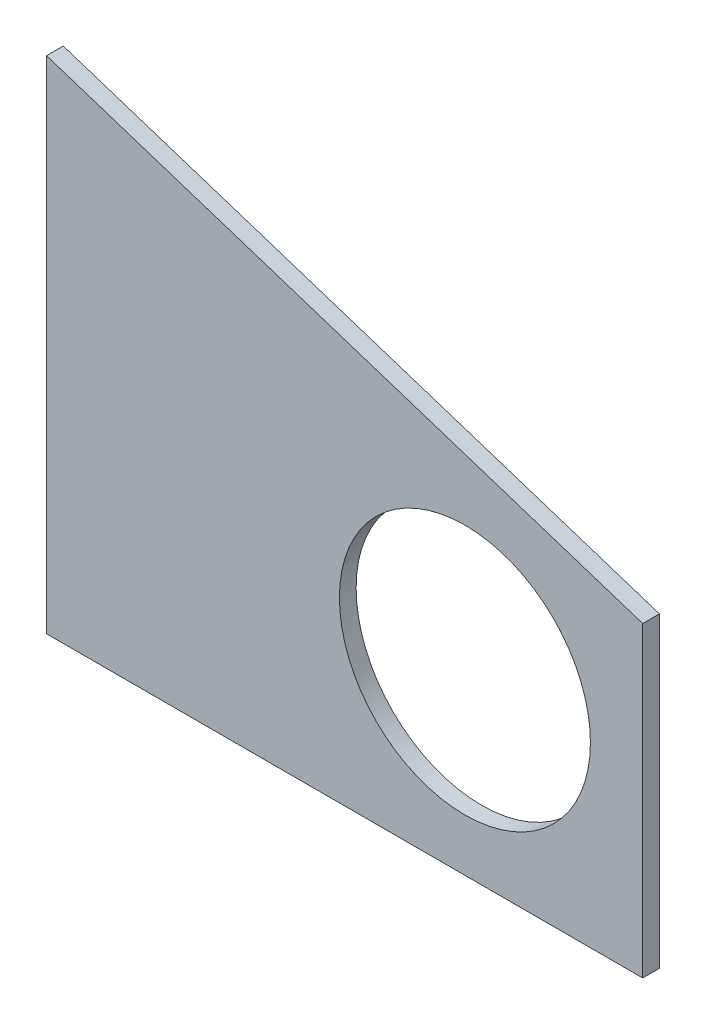
ISO-10303-21;
HEADER;
FILE_DESCRIPTION(('STEP AP214'),'2;1');
FILE_NAME('part.step','',(''),(''),'','','');
FILE_SCHEMA(('AUTOMOTIVE_DESIGN { 1 0 10303 214 1 1 1 1 }'));
ENDSEC;
DATA;
#1=APPLICATION_CONTEXT('core data for automotive mechanical design processes');
#2=APPLICATION_PROTOCOL_DEFINITION('international standard','automotive_design',2000,#1);
#3=PRODUCT_CONTEXT('',#1,'mechanical');
#4=PRODUCT('Part','Part','',(#3));
#5=PRODUCT_RELATED_PRODUCT_CATEGORY('part','',(#4));
#6=PRODUCT_DEFINITION_FORMATION('','',#4);
#7=PRODUCT_DEFINITION_CONTEXT('part definition',#1,'design');
#8=PRODUCT_DEFINITION('design','',#6,#7);
#9=PRODUCT_DEFINITION_SHAPE('','',#8);
#10=(LENGTH_UNIT() NAMED_UNIT(*) SI_UNIT(.MILLI.,.METRE.));
#11=(NAMED_UNIT(*) PLANE_ANGLE_UNIT() SI_UNIT($,.RADIAN.));
#12=(NAMED_UNIT(*) SI_UNIT($,.STERADIAN.) SOLID_ANGLE_UNIT());
#13=UNCERTAINTY_MEASURE_WITH_UNIT(LENGTH_MEASURE(1.E-05),#10,'distance_accuracy_value','');
#14=(GEOMETRIC_REPRESENTATION_CONTEXT(3) GLOBAL_UNCERTAINTY_ASSIGNED_CONTEXT((#13)) GLOBAL_UNIT_ASSIGNED_CONTEXT((#10,
#11,#12)) REPRESENTATION_CONTEXT('',''));
#15=CARTESIAN_POINT('',(0.,0.,0.));
#16=DIRECTION('',(0.,0.,1.));
#17=DIRECTION('',(1.,0.,0.));
#18=AXIS2_PLACEMENT_3D('',#15,#16,#17);
#19=CARTESIAN_POINT('',(0.,0.,8.));
#20=DIRECTION('',(0.,0.,-1.));
#21=DIRECTION('',(-1.,0.,0.));
#22=AXIS2_PLACEMENT_3D('',#19,#20,#21);
#23=PLANE('',#22);
#24=DIRECTION('',(1.,0.,0.));
#25=VECTOR('',#24,1.);
#26=CARTESIAN_POINT('',(285.,0.,8.));
#27=LINE('',#26,#25);
#28=CARTESIAN_POINT('',(0.,0.,8.));
#29=VERTEX_POINT('',#28);
#30=CARTESIAN_POINT('',(285.,0.,8.));
#31=VERTEX_POINT('',#30);
#32=EDGE_CURVE('E87',#29,#31,#27,.T.);
#33=ORIENTED_EDGE('',*,*,#32,.T.);
#34=DIRECTION('',(0.,1.,0.));
#35=VECTOR('',#34,1.);
#36=CARTESIAN_POINT('',(285.,146.756114880455,8.));
#37=LINE('',#36,#35);
#38=CARTESIAN_POINT('',(285.,146.756114880455,8.));
#39=VERTEX_POINT('',#38);
#40=EDGE_CURVE('E82',#31,#39,#37,.T.);
#41=ORIENTED_EDGE('',*,*,#40,.T.);
#42=DIRECTION('',(-0.951056516295152,0.309016994374951,0.));
#43=VECTOR('',#42,1.);
#44=CARTESIAN_POINT('',(0.,239.358228306835,8.));
#45=LINE('',#44,#43);
#46=CARTESIAN_POINT('',(0.,239.358228306835,8.));
#47=VERTEX_POINT('',#46);
#48=EDGE_CURVE('E85',#39,#47,#45,.T.);
#49=ORIENTED_EDGE('',*,*,#48,.T.);
#50=DIRECTION('',(0.,-1.,0.));
#51=VECTOR('',#50,1.);
#52=CARTESIAN_POINT('',(0.,0.,8.));
#53=LINE('',#52,#51);
#54=EDGE_CURVE('E52',#47,#29,#53,.T.);
#55=ORIENTED_EDGE('',*,*,#54,.T.);
#56=EDGE_LOOP('',(#33,#41,#49,#55));
#57=FACE_BOUND('',#56,.T.);
#58=CARTESIAN_POINT('',(200.,85.,8.));
#59=DIRECTION('',(0.,0.,1.));
#60=DIRECTION('',(1.,0.,0.));
#61=AXIS2_PLACEMENT_3D('',#58,#59,#60);
#62=CIRCLE('',#61,60.);
#63=CARTESIAN_POINT('',(260.,85.,8.));
#64=VERTEX_POINT('',#63);
#65=EDGE_CURVE('E102',#64,#64,#62,.T.);
#66=ORIENTED_EDGE('',*,*,#65,.F.);
#67=EDGE_LOOP('',(#66));
#68=FACE_BOUND('',#67,.T.);
#69=ADVANCED_FACE('F35',(#57,#68),#23,.F.);
#70=CARTESIAN_POINT('',(0.,0.,0.));
#71=DIRECTION('',(0.,0.,-1.));
#72=DIRECTION('',(-1.,0.,0.));
#73=AXIS2_PLACEMENT_3D('',#70,#71,#72);
#74=PLANE('',#73);
#75=DIRECTION('',(1.,0.,0.));
#76=VECTOR('',#75,1.);
#77=CARTESIAN_POINT('',(285.,0.,0.));
#78=LINE('',#77,#76);
#79=CARTESIAN_POINT('',(0.,0.,0.));
#80=VERTEX_POINT('',#79);
#81=CARTESIAN_POINT('',(285.,0.,0.));
#82=VERTEX_POINT('',#81);
#83=EDGE_CURVE('E99',#80,#82,#78,.T.);
#84=ORIENTED_EDGE('',*,*,#83,.F.);
#85=DIRECTION('',(0.,-1.,0.));
#86=VECTOR('',#85,1.);
#87=CARTESIAN_POINT('',(0.,0.,0.));
#88=LINE('',#87,#86);
#89=CARTESIAN_POINT('',(0.,239.358228306835,0.));
#90=VERTEX_POINT('',#89);
#91=EDGE_CURVE('E75',#90,#80,#88,.T.);
#92=ORIENTED_EDGE('',*,*,#91,.F.);
#93=DIRECTION('',(-0.951056516295152,0.309016994374951,0.));
#94=VECTOR('',#93,1.);
#95=CARTESIAN_POINT('',(0.,239.358228306835,0.));
#96=LINE('',#95,#94);
#97=CARTESIAN_POINT('',(285.,146.756114880455,0.));
#98=VERTEX_POINT('',#97);
#99=EDGE_CURVE('E69',#98,#90,#96,.T.);
#100=ORIENTED_EDGE('',*,*,#99,.F.);
#101=DIRECTION('',(0.,1.,0.));
#102=VECTOR('',#101,1.);
#103=CARTESIAN_POINT('',(285.,146.756114880455,0.));
#104=LINE('',#103,#102);
#105=EDGE_CURVE('E91',#82,#98,#104,.T.);
#106=ORIENTED_EDGE('',*,*,#105,.F.);
#107=EDGE_LOOP('',(#84,#92,#100,#106));
#108=FACE_BOUND('',#107,.T.);
#109=CARTESIAN_POINT('',(200.,85.,0.));
#110=DIRECTION('',(0.,0.,1.));
#111=DIRECTION('',(1.,0.,0.));
#112=AXIS2_PLACEMENT_3D('',#109,#110,#111);
#113=CIRCLE('',#112,60.);
#114=CARTESIAN_POINT('',(260.,85.,0.));
#115=VERTEX_POINT('',#114);
#116=EDGE_CURVE('E114',#115,#115,#113,.T.);
#117=ORIENTED_EDGE('',*,*,#116,.T.);
#118=EDGE_LOOP('',(#117));
#119=FACE_BOUND('',#118,.T.);
#120=ADVANCED_FACE('F110',(#108,#119),#74,.T.);
#121=CARTESIAN_POINT('',(285.,0.,8.));
#122=DIRECTION('',(0.,1.,0.));
#123=DIRECTION('',(-1.,0.,0.));
#124=AXIS2_PLACEMENT_3D('',#121,#122,#123);
#125=PLANE('',#124);
#126=ORIENTED_EDGE('',*,*,#83,.T.);
#127=DIRECTION('',(0.,0.,-1.));
#128=VECTOR('',#127,1.);
#129=CARTESIAN_POINT('',(285.,0.,8.));
#130=LINE('',#129,#128);
#131=EDGE_CURVE('E11',#31,#82,#130,.T.);
#132=ORIENTED_EDGE('',*,*,#131,.F.);
#133=ORIENTED_EDGE('',*,*,#32,.F.);
#134=DIRECTION('',(0.,0.,-1.));
#135=VECTOR('',#134,1.);
#136=CARTESIAN_POINT('',(0.,0.,8.));
#137=LINE('',#136,#135);
#138=EDGE_CURVE('E95',#29,#80,#137,.T.);
#139=ORIENTED_EDGE('',*,*,#138,.T.);
#140=EDGE_LOOP('',(#126,#132,#133,#139));
#141=FACE_BOUND('',#140,.T.);
#142=ADVANCED_FACE('F37',(#141),#125,.F.);
#143=CARTESIAN_POINT('',(285.,146.756114880455,8.));
#144=DIRECTION('',(-1.,0.,0.));
#145=DIRECTION('',(0.,0.,1.));
#146=AXIS2_PLACEMENT_3D('',#143,#144,#145);
#147=PLANE('',#146);
#148=ORIENTED_EDGE('',*,*,#105,.T.);
#149=DIRECTION('',(0.,0.,-1.));
#150=VECTOR('',#149,1.);
#151=CARTESIAN_POINT('',(285.,146.756114880455,8.));
#152=LINE('',#151,#150);
#153=EDGE_CURVE('E44',#39,#98,#152,.T.);
#154=ORIENTED_EDGE('',*,*,#153,.F.);
#155=ORIENTED_EDGE('',*,*,#40,.F.);
#156=ORIENTED_EDGE('',*,*,#131,.T.);
#157=EDGE_LOOP('',(#148,#154,#155,#156));
#158=FACE_BOUND('',#157,.T.);
#159=ADVANCED_FACE('F90',(#158),#147,.F.);
#160=CARTESIAN_POINT('',(0.,239.358228306835,8.));
#161=DIRECTION('',(-0.309016994374951,-0.951056516295152,0.));
#162=DIRECTION('',(0.951056516295152,-0.309016994374951,0.));
#163=AXIS2_PLACEMENT_3D('',#160,#161,#162);
#164=PLANE('',#163);
#165=ORIENTED_EDGE('',*,*,#99,.T.);
#166=DIRECTION('',(0.,0.,-1.));
#167=VECTOR('',#166,1.);
#168=CARTESIAN_POINT('',(0.,239.358228306835,8.));
#169=LINE('',#168,#167);
#170=EDGE_CURVE('E92',#47,#90,#169,.T.);
#171=ORIENTED_EDGE('',*,*,#170,.F.);
#172=ORIENTED_EDGE('',*,*,#48,.F.);
#173=ORIENTED_EDGE('',*,*,#153,.T.);
#174=EDGE_LOOP('',(#165,#171,#172,#173));
#175=FACE_BOUND('',#174,.T.);
#176=ADVANCED_FACE('F93',(#175),#164,.F.);
#177=CARTESIAN_POINT('',(0.,0.,8.));
#178=DIRECTION('',(1.,0.,0.));
#179=DIRECTION('',(0.,0.,-1.));
#180=AXIS2_PLACEMENT_3D('',#177,#178,#179);
#181=PLANE('',#180);
#182=ORIENTED_EDGE('',*,*,#91,.T.);
#183=ORIENTED_EDGE('',*,*,#138,.F.);
#184=ORIENTED_EDGE('',*,*,#54,.F.);
#185=ORIENTED_EDGE('',*,*,#170,.T.);
#186=EDGE_LOOP('',(#182,#183,#184,#185));
#187=FACE_BOUND('',#186,.T.);
#188=ADVANCED_FACE('F107',(#187),#181,.F.);
#189=CARTESIAN_POINT('',(200.,85.,8.));
#190=DIRECTION('',(0.,0.,-1.));
#191=DIRECTION('',(-1.,0.,0.));
#192=AXIS2_PLACEMENT_3D('',#189,#190,#191);
#193=CYLINDRICAL_SURFACE('',#192,60.);
#194=ORIENTED_EDGE('',*,*,#65,.T.);
#195=EDGE_LOOP('',(#194));
#196=FACE_BOUND('',#195,.T.);
#197=ORIENTED_EDGE('',*,*,#116,.F.);
#198=EDGE_LOOP('',(#197));
#199=FACE_BOUND('',#198,.T.);
#200=ADVANCED_FACE('F120',(#196,#199),#193,.F.);
#201=CLOSED_SHELL('',(#69,#120,#142,#159,#176,#188,#200));
#202=MANIFOLD_SOLID_BREP('B2',#201);
#203=ADVANCED_BREP_SHAPE_REPRESENTATION('',(#18,#202),#14);
#204=SHAPE_DEFINITION_REPRESENTATION(#9,#203);
ENDSEC;
END-ISO-10303-21;
